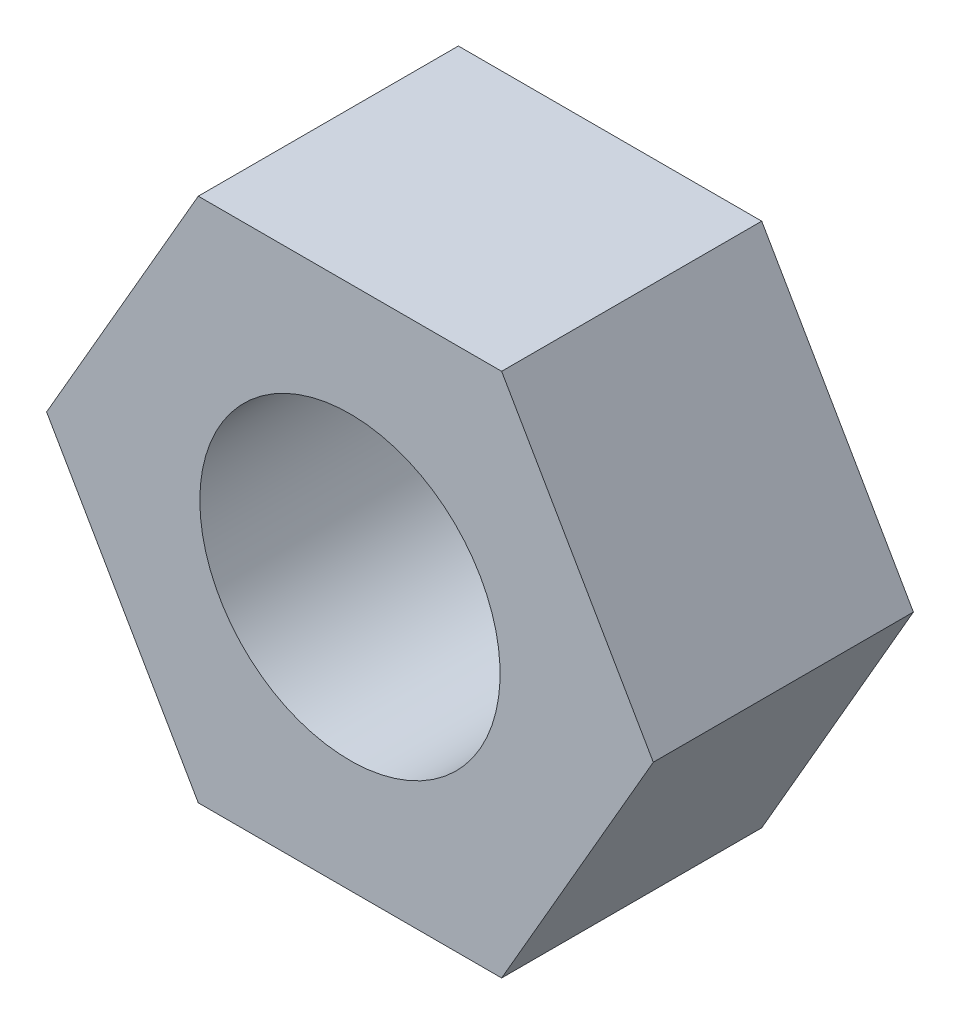
ISO-10303-21;
HEADER;
FILE_DESCRIPTION(('STEP AP214'),'2;1');
FILE_NAME('part.step','',(''),(''),'','','');
FILE_SCHEMA(('AUTOMOTIVE_DESIGN { 1 0 10303 214 1 1 1 1 }'));
ENDSEC;
DATA;
#1=APPLICATION_CONTEXT('core data for automotive mechanical design processes');
#2=APPLICATION_PROTOCOL_DEFINITION('international standard','automotive_design',2000,#1);
#3=PRODUCT_CONTEXT('',#1,'mechanical');
#4=PRODUCT('Part','Part','',(#3));
#5=PRODUCT_RELATED_PRODUCT_CATEGORY('part','',(#4));
#6=PRODUCT_DEFINITION_FORMATION('','',#4);
#7=PRODUCT_DEFINITION_CONTEXT('part definition',#1,'design');
#8=PRODUCT_DEFINITION('design','',#6,#7);
#9=PRODUCT_DEFINITION_SHAPE('','',#8);
#10=(LENGTH_UNIT() NAMED_UNIT(*) SI_UNIT(.MILLI.,.METRE.));
#11=(NAMED_UNIT(*) PLANE_ANGLE_UNIT() SI_UNIT($,.RADIAN.));
#12=(NAMED_UNIT(*) SI_UNIT($,.STERADIAN.) SOLID_ANGLE_UNIT());
#13=UNCERTAINTY_MEASURE_WITH_UNIT(LENGTH_MEASURE(1.E-05),#10,'distance_accuracy_value','');
#14=(GEOMETRIC_REPRESENTATION_CONTEXT(3) GLOBAL_UNCERTAINTY_ASSIGNED_CONTEXT((#13)) GLOBAL_UNIT_ASSIGNED_CONTEXT((#10,
#11,#12)) REPRESENTATION_CONTEXT('',''));
#15=CARTESIAN_POINT('',(0.,0.,0.));
#16=DIRECTION('',(0.,0.,1.));
#17=DIRECTION('',(1.,0.,0.));
#18=AXIS2_PLACEMENT_3D('',#15,#16,#17);
#19=CARTESIAN_POINT('',(-65.,0.,293.));
#20=DIRECTION('',(0.,0.,-1.));
#21=DIRECTION('',(-1.,0.,0.));
#22=AXIS2_PLACEMENT_3D('',#19,#20,#21);
#23=CYLINDRICAL_SURFACE('',#22,3.175);
#24=DIRECTION('',(0.,0.,-1.));
#25=VECTOR('',#24,1.);
#26=CARTESIAN_POINT('',(-68.175,0.,293.));
#27=LINE('',#26,#25);
#28=CARTESIAN_POINT('',(-68.175,0.,293.));
#29=VERTEX_POINT('',#28);
#30=CARTESIAN_POINT('',(-68.175,0.,287.5));
#31=VERTEX_POINT('',#30);
#32=EDGE_CURVE('E10',#29,#31,#27,.T.);
#33=ORIENTED_EDGE('',*,*,#32,.F.);
#34=CARTESIAN_POINT('',(-65.,0.,293.));
#35=DIRECTION('',(0.,0.,-1.));
#36=DIRECTION('',(-1.,0.,0.));
#37=AXIS2_PLACEMENT_3D('',#34,#35,#36);
#38=CIRCLE('',#37,3.175);
#39=EDGE_CURVE('E138',#29,#29,#38,.T.);
#40=ORIENTED_EDGE('',*,*,#39,.F.);
#41=ORIENTED_EDGE('',*,*,#32,.T.);
#42=CARTESIAN_POINT('',(-65.,0.,287.5));
#43=DIRECTION('',(0.,0.,-1.));
#44=DIRECTION('',(-1.,0.,0.));
#45=AXIS2_PLACEMENT_3D('',#42,#43,#44);
#46=CIRCLE('',#45,3.175);
#47=EDGE_CURVE('E98',#31,#31,#46,.T.);
#48=ORIENTED_EDGE('',*,*,#47,.T.);
#49=EDGE_LOOP('',(#33,#40,#41,#48));
#50=FACE_BOUND('',#49,.T.);
#51=ADVANCED_FACE('F16',(#50),#23,.F.);
#52=CARTESIAN_POINT('',(-71.415,0.,287.5));
#53=DIRECTION('',(0.866025403784329,0.50000000000019,0.));
#54=DIRECTION('',(0.,0.,-1.));
#55=AXIS2_PLACEMENT_3D('',#52,#53,#54);
#56=PLANE('',#55);
#57=DIRECTION('',(0.50000000000019,-0.866025403784329,0.));
#58=VECTOR('',#57,1.);
#59=CARTESIAN_POINT('',(-71.415,0.,287.5));
#60=LINE('',#59,#58);
#61=CARTESIAN_POINT('',(-71.415,0.,287.5));
#62=VERTEX_POINT('',#61);
#63=CARTESIAN_POINT('',(-68.2075,-5.555552965277,287.5));
#64=VERTEX_POINT('',#63);
#65=EDGE_CURVE('E130',#62,#64,#60,.T.);
#66=ORIENTED_EDGE('',*,*,#65,.T.);
#67=DIRECTION('',(0.,0.,1.));
#68=VECTOR('',#67,1.);
#69=CARTESIAN_POINT('',(-68.2075,-5.555552965277,287.5));
#70=LINE('',#69,#68);
#71=CARTESIAN_POINT('',(-68.2075,-5.555552965277,293.));
#72=VERTEX_POINT('',#71);
#73=EDGE_CURVE('E144',#64,#72,#70,.T.);
#74=ORIENTED_EDGE('',*,*,#73,.T.);
#75=DIRECTION('',(0.50000000000019,-0.866025403784329,0.));
#76=VECTOR('',#75,1.);
#77=CARTESIAN_POINT('',(-71.415,0.,293.));
#78=LINE('',#77,#76);
#79=CARTESIAN_POINT('',(-71.415,0.,293.));
#80=VERTEX_POINT('',#79);
#81=EDGE_CURVE('E97',#80,#72,#78,.T.);
#82=ORIENTED_EDGE('',*,*,#81,.F.);
#83=DIRECTION('',(0.,0.,1.));
#84=VECTOR('',#83,1.);
#85=CARTESIAN_POINT('',(-71.415,0.,287.5));
#86=LINE('',#85,#84);
#87=EDGE_CURVE('E27',#62,#80,#86,.T.);
#88=ORIENTED_EDGE('',*,*,#87,.F.);
#89=EDGE_LOOP('',(#66,#74,#82,#88));
#90=FACE_BOUND('',#89,.T.);
#91=ADVANCED_FACE('F197',(#90),#56,.F.);
#92=CARTESIAN_POINT('',(-68.2075,5.555552965277,287.5));
#93=DIRECTION('',(0.866025403784329,-0.50000000000019,0.));
#94=DIRECTION('',(0.,0.,-1.));
#95=AXIS2_PLACEMENT_3D('',#92,#93,#94);
#96=PLANE('',#95);
#97=DIRECTION('',(-0.50000000000019,-0.866025403784329,0.));
#98=VECTOR('',#97,1.);
#99=CARTESIAN_POINT('',(-68.2075,5.555552965277,287.5));
#100=LINE('',#99,#98);
#101=CARTESIAN_POINT('',(-68.2075,5.555552965277,287.5));
#102=VERTEX_POINT('',#101);
#103=EDGE_CURVE('E123',#102,#62,#100,.T.);
#104=ORIENTED_EDGE('',*,*,#103,.T.);
#105=ORIENTED_EDGE('',*,*,#87,.T.);
#106=DIRECTION('',(-0.50000000000019,-0.866025403784329,0.));
#107=VECTOR('',#106,1.);
#108=CARTESIAN_POINT('',(-68.2075,5.555552965277,293.));
#109=LINE('',#108,#107);
#110=CARTESIAN_POINT('',(-68.2075,5.555552965277,293.));
#111=VERTEX_POINT('',#110);
#112=EDGE_CURVE('E85',#111,#80,#109,.T.);
#113=ORIENTED_EDGE('',*,*,#112,.F.);
#114=DIRECTION('',(0.,0.,1.));
#115=VECTOR('',#114,1.);
#116=CARTESIAN_POINT('',(-68.2075,5.555552965277,287.5));
#117=LINE('',#116,#115);
#118=EDGE_CURVE('E90',#102,#111,#117,.T.);
#119=ORIENTED_EDGE('',*,*,#118,.F.);
#120=EDGE_LOOP('',(#104,#105,#113,#119));
#121=FACE_BOUND('',#120,.T.);
#122=ADVANCED_FACE('F88',(#121),#96,.F.);
#123=CARTESIAN_POINT('',(-68.2075,-5.555552965277,287.5));
#124=DIRECTION('',(0.,1.,0.));
#125=DIRECTION('',(1.,0.,0.));
#126=AXIS2_PLACEMENT_3D('',#123,#124,#125);
#127=PLANE('',#126);
#128=DIRECTION('',(1.,0.,0.));
#129=VECTOR('',#128,1.);
#130=CARTESIAN_POINT('',(-68.2075,-5.555552965277,287.5));
#131=LINE('',#130,#129);
#132=CARTESIAN_POINT('',(-61.7925,-5.555552965277,287.5));
#133=VERTEX_POINT('',#132);
#134=EDGE_CURVE('E109',#64,#133,#131,.T.);
#135=ORIENTED_EDGE('',*,*,#134,.T.);
#136=DIRECTION('',(0.,0.,1.));
#137=VECTOR('',#136,1.);
#138=CARTESIAN_POINT('',(-61.7925,-5.555552965277,287.5));
#139=LINE('',#138,#137);
#140=CARTESIAN_POINT('',(-61.7925,-5.555552965277,293.));
#141=VERTEX_POINT('',#140);
#142=EDGE_CURVE('E119',#133,#141,#139,.T.);
#143=ORIENTED_EDGE('',*,*,#142,.T.);
#144=DIRECTION('',(1.,0.,0.));
#145=VECTOR('',#144,1.);
#146=CARTESIAN_POINT('',(-68.2075,-5.555552965277,293.));
#147=LINE('',#146,#145);
#148=EDGE_CURVE('E20',#72,#141,#147,.T.);
#149=ORIENTED_EDGE('',*,*,#148,.F.);
#150=ORIENTED_EDGE('',*,*,#73,.F.);
#151=EDGE_LOOP('',(#135,#143,#149,#150));
#152=FACE_BOUND('',#151,.T.);
#153=ADVANCED_FACE('F194',(#152),#127,.F.);
#154=CARTESIAN_POINT('',(-65.,0.,293.));
#155=DIRECTION('',(0.,0.,1.));
#156=DIRECTION('',(1.,0.,0.));
#157=AXIS2_PLACEMENT_3D('',#154,#155,#156);
#158=PLANE('',#157);
#159=ORIENTED_EDGE('',*,*,#39,.T.);
#160=EDGE_LOOP('',(#159));
#161=FACE_BOUND('',#160,.T.);
#162=DIRECTION('',(-0.50000000000019,0.866025403784329,0.));
#163=VECTOR('',#162,1.);
#164=CARTESIAN_POINT('',(-58.585,0.,293.));
#165=LINE('',#164,#163);
#166=CARTESIAN_POINT('',(-58.585,0.,293.));
#167=VERTEX_POINT('',#166);
#168=CARTESIAN_POINT('',(-61.7925,5.555552965277,293.));
#169=VERTEX_POINT('',#168);
#170=EDGE_CURVE('E104',#167,#169,#165,.T.);
#171=ORIENTED_EDGE('',*,*,#170,.T.);
#172=DIRECTION('',(-1.,0.,0.));
#173=VECTOR('',#172,1.);
#174=CARTESIAN_POINT('',(-61.7925,5.555552965277,293.));
#175=LINE('',#174,#173);
#176=EDGE_CURVE('E101',#169,#111,#175,.T.);
#177=ORIENTED_EDGE('',*,*,#176,.T.);
#178=ORIENTED_EDGE('',*,*,#112,.T.);
#179=ORIENTED_EDGE('',*,*,#81,.T.);
#180=ORIENTED_EDGE('',*,*,#148,.T.);
#181=DIRECTION('',(0.50000000000019,0.866025403784329,0.));
#182=VECTOR('',#181,1.);
#183=CARTESIAN_POINT('',(-61.7925,-5.555552965277,293.));
#184=LINE('',#183,#182);
#185=EDGE_CURVE('E127',#141,#167,#184,.T.);
#186=ORIENTED_EDGE('',*,*,#185,.T.);
#187=EDGE_LOOP('',(#171,#177,#178,#179,#180,#186));
#188=FACE_BOUND('',#187,.T.);
#189=ADVANCED_FACE('F102',(#161,#188),#158,.T.);
#190=CARTESIAN_POINT('',(-65.,0.,287.5));
#191=DIRECTION('',(0.,0.,1.));
#192=DIRECTION('',(1.,0.,0.));
#193=AXIS2_PLACEMENT_3D('',#190,#191,#192);
#194=PLANE('',#193);
#195=ORIENTED_EDGE('',*,*,#47,.F.);
#196=EDGE_LOOP('',(#195));
#197=FACE_BOUND('',#196,.T.);
#198=DIRECTION('',(0.50000000000019,0.866025403784329,0.));
#199=VECTOR('',#198,1.);
#200=CARTESIAN_POINT('',(-61.7925,-5.555552965277,287.5));
#201=LINE('',#200,#199);
#202=CARTESIAN_POINT('',(-58.585,0.,287.5));
#203=VERTEX_POINT('',#202);
#204=EDGE_CURVE('E125',#133,#203,#201,.T.);
#205=ORIENTED_EDGE('',*,*,#204,.F.);
#206=ORIENTED_EDGE('',*,*,#134,.F.);
#207=ORIENTED_EDGE('',*,*,#65,.F.);
#208=ORIENTED_EDGE('',*,*,#103,.F.);
#209=DIRECTION('',(-1.,0.,0.));
#210=VECTOR('',#209,1.);
#211=CARTESIAN_POINT('',(-61.7925,5.555552965277,287.5));
#212=LINE('',#211,#210);
#213=CARTESIAN_POINT('',(-61.7925,5.555552965277,287.5));
#214=VERTEX_POINT('',#213);
#215=EDGE_CURVE('E112',#214,#102,#212,.T.);
#216=ORIENTED_EDGE('',*,*,#215,.F.);
#217=DIRECTION('',(-0.50000000000019,0.866025403784329,0.));
#218=VECTOR('',#217,1.);
#219=CARTESIAN_POINT('',(-58.585,0.,287.5));
#220=LINE('',#219,#218);
#221=EDGE_CURVE('E159',#203,#214,#220,.T.);
#222=ORIENTED_EDGE('',*,*,#221,.F.);
#223=EDGE_LOOP('',(#205,#206,#207,#208,#216,#222));
#224=FACE_BOUND('',#223,.T.);
#225=ADVANCED_FACE('F178',(#197,#224),#194,.F.);
#226=CARTESIAN_POINT('',(-61.7925,5.555552965277,287.5));
#227=DIRECTION('',(0.,-1.,0.));
#228=DIRECTION('',(-1.,0.,0.));
#229=AXIS2_PLACEMENT_3D('',#226,#227,#228);
#230=PLANE('',#229);
#231=ORIENTED_EDGE('',*,*,#215,.T.);
#232=ORIENTED_EDGE('',*,*,#118,.T.);
#233=ORIENTED_EDGE('',*,*,#176,.F.);
#234=DIRECTION('',(0.,0.,1.));
#235=VECTOR('',#234,1.);
#236=CARTESIAN_POINT('',(-61.7925,5.555552965277,287.5));
#237=LINE('',#236,#235);
#238=EDGE_CURVE('E133',#214,#169,#237,.T.);
#239=ORIENTED_EDGE('',*,*,#238,.F.);
#240=EDGE_LOOP('',(#231,#232,#233,#239));
#241=FACE_BOUND('',#240,.T.);
#242=ADVANCED_FACE('F111',(#241),#230,.F.);
#243=CARTESIAN_POINT('',(-61.7925,-5.555552965277,287.5));
#244=DIRECTION('',(-0.866025403784329,0.50000000000019,0.));
#245=DIRECTION('',(0.,0.,1.));
#246=AXIS2_PLACEMENT_3D('',#243,#244,#245);
#247=PLANE('',#246);
#248=ORIENTED_EDGE('',*,*,#204,.T.);
#249=DIRECTION('',(0.,0.,1.));
#250=VECTOR('',#249,1.);
#251=CARTESIAN_POINT('',(-58.585,0.,287.5));
#252=LINE('',#251,#250);
#253=EDGE_CURVE('E128',#203,#167,#252,.T.);
#254=ORIENTED_EDGE('',*,*,#253,.T.);
#255=ORIENTED_EDGE('',*,*,#185,.F.);
#256=ORIENTED_EDGE('',*,*,#142,.F.);
#257=EDGE_LOOP('',(#248,#254,#255,#256));
#258=FACE_BOUND('',#257,.T.);
#259=ADVANCED_FACE('F18',(#258),#247,.F.);
#260=CARTESIAN_POINT('',(-58.585,0.,287.5));
#261=DIRECTION('',(-0.866025403784329,-0.50000000000019,0.));
#262=DIRECTION('',(-0.50000000000019,0.866025403784329,0.));
#263=AXIS2_PLACEMENT_3D('',#260,#261,#262);
#264=PLANE('',#263);
#265=ORIENTED_EDGE('',*,*,#221,.T.);
#266=ORIENTED_EDGE('',*,*,#238,.T.);
#267=ORIENTED_EDGE('',*,*,#170,.F.);
#268=ORIENTED_EDGE('',*,*,#253,.F.);
#269=EDGE_LOOP('',(#265,#266,#267,#268));
#270=FACE_BOUND('',#269,.T.);
#271=ADVANCED_FACE('F176',(#270),#264,.F.);
#272=CLOSED_SHELL('',(#51,#91,#122,#153,#189,#225,#242,#259,#271));
#273=MANIFOLD_SOLID_BREP('B1',#272);
#274=ADVANCED_BREP_SHAPE_REPRESENTATION('',(#18,#273),#14);
#275=SHAPE_DEFINITION_REPRESENTATION(#9,#274);
ENDSEC;
END-ISO-10303-21;
